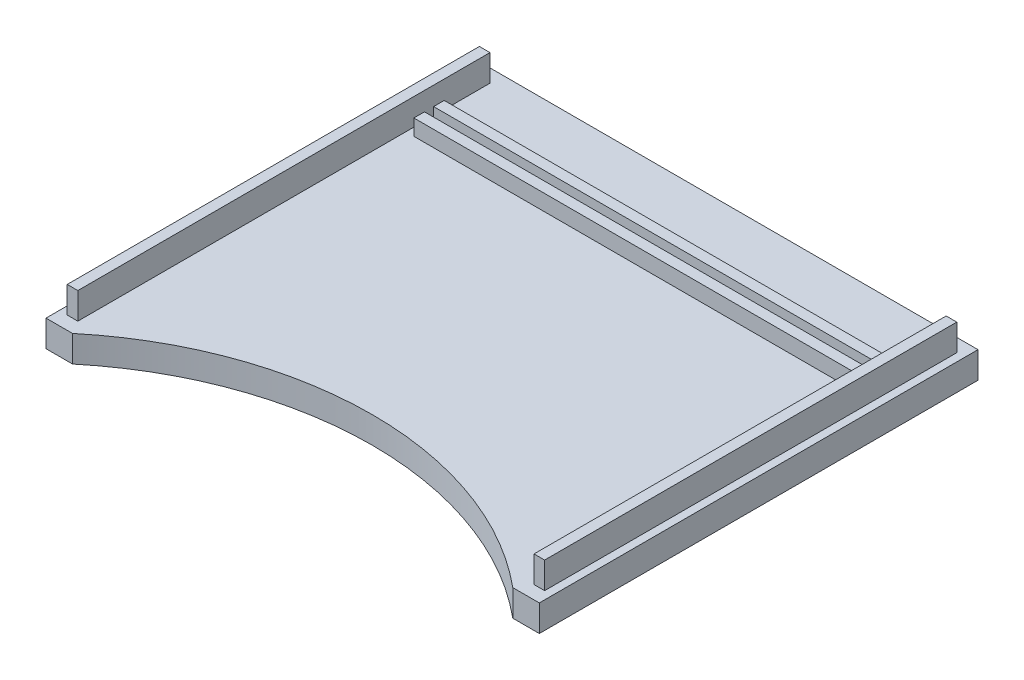
ISO-10303-21;
HEADER;
FILE_DESCRIPTION(('STEP AP214'),'2;1');
FILE_NAME('part.step','',(''),(''),'','','');
FILE_SCHEMA(('AUTOMOTIVE_DESIGN { 1 0 10303 214 1 1 1 1 }'));
ENDSEC;
DATA;
#1=APPLICATION_CONTEXT('core data for automotive mechanical design processes');
#2=APPLICATION_PROTOCOL_DEFINITION('international standard','automotive_design',2000,#1);
#3=PRODUCT_CONTEXT('',#1,'mechanical');
#4=PRODUCT('Part','Part','',(#3));
#5=PRODUCT_RELATED_PRODUCT_CATEGORY('part','',(#4));
#6=PRODUCT_DEFINITION_FORMATION('','',#4);
#7=PRODUCT_DEFINITION_CONTEXT('part definition',#1,'design');
#8=PRODUCT_DEFINITION('design','',#6,#7);
#9=PRODUCT_DEFINITION_SHAPE('','',#8);
#10=(LENGTH_UNIT() NAMED_UNIT(*) SI_UNIT(.MILLI.,.METRE.));
#11=(NAMED_UNIT(*) PLANE_ANGLE_UNIT() SI_UNIT($,.RADIAN.));
#12=(NAMED_UNIT(*) SI_UNIT($,.STERADIAN.) SOLID_ANGLE_UNIT());
#13=UNCERTAINTY_MEASURE_WITH_UNIT(LENGTH_MEASURE(1.E-05),#10,'distance_accuracy_value','');
#14=(GEOMETRIC_REPRESENTATION_CONTEXT(3) GLOBAL_UNCERTAINTY_ASSIGNED_CONTEXT((#13)) GLOBAL_UNIT_ASSIGNED_CONTEXT((#10,
#11,#12)) REPRESENTATION_CONTEXT('',''));
#15=CARTESIAN_POINT('',(0.,0.,0.));
#16=DIRECTION('',(0.,0.,1.));
#17=DIRECTION('',(1.,0.,0.));
#18=AXIS2_PLACEMENT_3D('',#15,#16,#17);
#19=CARTESIAN_POINT('',(0.,10.,0.));
#20=DIRECTION('',(0.,-1.,0.));
#21=DIRECTION('',(0.,0.,-1.));
#22=AXIS2_PLACEMENT_3D('',#19,#20,#21);
#23=PLANE('',#22);
#24=DIRECTION('',(0.,0.,1.));
#25=VECTOR('',#24,1.);
#26=CARTESIAN_POINT('',(179.,10.,-160.4));
#27=LINE('',#26,#25);
#28=CARTESIAN_POINT('',(179.,10.,-160.4));
#29=VERTEX_POINT('',#28);
#30=CARTESIAN_POINT('',(179.,10.,-5.));
#31=VERTEX_POINT('',#30);
#32=EDGE_CURVE('E205',#29,#31,#27,.T.);
#33=ORIENTED_EDGE('',*,*,#32,.F.);
#34=DIRECTION('',(-1.,0.,0.));
#35=VECTOR('',#34,1.);
#36=CARTESIAN_POINT('',(179.,10.,-160.4));
#37=LINE('',#36,#35);
#38=CARTESIAN_POINT('',(183.,10.,-160.4));
#39=VERTEX_POINT('',#38);
#40=EDGE_CURVE('E218',#39,#29,#37,.T.);
#41=ORIENTED_EDGE('',*,*,#40,.F.);
#42=DIRECTION('',(0.,0.,-1.));
#43=VECTOR('',#42,1.);
#44=CARTESIAN_POINT('',(183.,10.,-160.4));
#45=LINE('',#44,#43);
#46=CARTESIAN_POINT('',(183.,10.,-5.));
#47=VERTEX_POINT('',#46);
#48=EDGE_CURVE('E227',#47,#39,#45,.T.);
#49=ORIENTED_EDGE('',*,*,#48,.F.);
#50=DIRECTION('',(1.,0.,0.));
#51=VECTOR('',#50,1.);
#52=CARTESIAN_POINT('',(179.,10.,-5.));
#53=LINE('',#52,#51);
#54=EDGE_CURVE('E208',#31,#47,#53,.T.);
#55=ORIENTED_EDGE('',*,*,#54,.F.);
#56=EDGE_LOOP('',(#33,#41,#49,#55));
#57=FACE_BOUND('',#56,.T.);
#58=DIRECTION('',(0.,0.,1.));
#59=VECTOR('',#58,1.);
#60=CARTESIAN_POINT('',(9.99999999999995,10.,-132.7));
#61=LINE('',#60,#59);
#62=CARTESIAN_POINT('',(9.99999999999995,10.,-132.7));
#63=VERTEX_POINT('',#62);
#64=CARTESIAN_POINT('',(9.99999999999994,10.,-128.7));
#65=VERTEX_POINT('',#64);
#66=EDGE_CURVE('E276',#63,#65,#61,.T.);
#67=ORIENTED_EDGE('',*,*,#66,.F.);
#68=DIRECTION('',(-1.,0.,0.));
#69=VECTOR('',#68,1.);
#70=CARTESIAN_POINT('',(9.99999999999995,10.,-132.7));
#71=LINE('',#70,#69);
#72=CARTESIAN_POINT('',(176.,10.,-132.7));
#73=VERTEX_POINT('',#72);
#74=EDGE_CURVE('E281',#73,#63,#71,.T.);
#75=ORIENTED_EDGE('',*,*,#74,.F.);
#76=DIRECTION('',(0.,0.,-1.));
#77=VECTOR('',#76,1.);
#78=CARTESIAN_POINT('',(176.,10.,-132.7));
#79=LINE('',#78,#77);
#80=CARTESIAN_POINT('',(176.,10.,-128.7));
#81=VERTEX_POINT('',#80);
#82=EDGE_CURVE('E293',#81,#73,#79,.T.);
#83=ORIENTED_EDGE('',*,*,#82,.F.);
#84=DIRECTION('',(1.,0.,0.));
#85=VECTOR('',#84,1.);
#86=CARTESIAN_POINT('',(9.99999999999994,10.,-128.7));
#87=LINE('',#86,#85);
#88=EDGE_CURVE('E290',#65,#81,#87,.T.);
#89=ORIENTED_EDGE('',*,*,#88,.F.);
#90=EDGE_LOOP('',(#67,#75,#83,#89));
#91=FACE_BOUND('',#90,.T.);
#92=DIRECTION('',(1.,0.,0.));
#93=VECTOR('',#92,1.);
#94=CARTESIAN_POINT('',(0.,10.,0.));
#95=LINE('',#94,#93);
#96=CARTESIAN_POINT('',(0.,10.,0.));
#97=VERTEX_POINT('',#96);
#98=CARTESIAN_POINT('',(10.,10.,0.));
#99=VERTEX_POINT('',#98);
#100=EDGE_CURVE('E325',#97,#99,#95,.T.);
#101=ORIENTED_EDGE('',*,*,#100,.T.);
#102=CARTESIAN_POINT('',(93.,10.,99.8166666666667));
#103=DIRECTION('',(0.,1.,0.));
#104=DIRECTION('',(0.,0.,-1.));
#105=AXIS2_PLACEMENT_3D('',#102,#103,#104);
#106=CIRCLE('',#105,129.816666666667);
#107=CARTESIAN_POINT('',(176.,10.,0.));
#108=VERTEX_POINT('',#107);
#109=EDGE_CURVE('E309',#108,#99,#106,.T.);
#110=ORIENTED_EDGE('',*,*,#109,.F.);
#111=CARTESIAN_POINT('',(186.,10.,0.));
#112=VERTEX_POINT('',#111);
#113=EDGE_CURVE('E323',#108,#112,#95,.T.);
#114=ORIENTED_EDGE('',*,*,#113,.T.);
#115=DIRECTION('',(0.,0.,-1.));
#116=VECTOR('',#115,1.);
#117=CARTESIAN_POINT('',(186.,10.,0.));
#118=LINE('',#117,#116);
#119=CARTESIAN_POINT('',(186.,10.,-165.4));
#120=VERTEX_POINT('',#119);
#121=EDGE_CURVE('E328',#112,#120,#118,.T.);
#122=ORIENTED_EDGE('',*,*,#121,.T.);
#123=DIRECTION('',(-1.,0.,0.));
#124=VECTOR('',#123,1.);
#125=CARTESIAN_POINT('',(0.,10.,-165.4));
#126=LINE('',#125,#124);
#127=CARTESIAN_POINT('',(0.,10.,-165.4));
#128=VERTEX_POINT('',#127);
#129=EDGE_CURVE('E330',#120,#128,#126,.T.);
#130=ORIENTED_EDGE('',*,*,#129,.T.);
#131=DIRECTION('',(0.,0.,1.));
#132=VECTOR('',#131,1.);
#133=CARTESIAN_POINT('',(0.,10.,0.));
#134=LINE('',#133,#132);
#135=EDGE_CURVE('E320',#128,#97,#134,.T.);
#136=ORIENTED_EDGE('',*,*,#135,.T.);
#137=EDGE_LOOP('',(#101,#110,#114,#122,#130,#136));
#138=FACE_BOUND('',#137,.T.);
#139=DIRECTION('',(0.,0.,1.));
#140=VECTOR('',#139,1.);
#141=CARTESIAN_POINT('',(9.99999999999991,10.,-140.14));
#142=LINE('',#141,#140);
#143=CARTESIAN_POINT('',(9.99999999999991,10.,-140.14));
#144=VERTEX_POINT('',#143);
#145=CARTESIAN_POINT('',(9.99999999999991,10.,-136.14));
#146=VERTEX_POINT('',#145);
#147=EDGE_CURVE('E243',#144,#146,#142,.T.);
#148=ORIENTED_EDGE('',*,*,#147,.F.);
#149=DIRECTION('',(-1.,0.,0.));
#150=VECTOR('',#149,1.);
#151=CARTESIAN_POINT('',(9.99999999999991,10.,-140.14));
#152=LINE('',#151,#150);
#153=CARTESIAN_POINT('',(176.,10.,-140.14));
#154=VERTEX_POINT('',#153);
#155=EDGE_CURVE('E248',#154,#144,#152,.T.);
#156=ORIENTED_EDGE('',*,*,#155,.F.);
#157=DIRECTION('',(0.,0.,-1.));
#158=VECTOR('',#157,1.);
#159=CARTESIAN_POINT('',(176.,10.,-140.14));
#160=LINE('',#159,#158);
#161=CARTESIAN_POINT('',(176.,10.,-136.14));
#162=VERTEX_POINT('',#161);
#163=EDGE_CURVE('E260',#162,#154,#160,.T.);
#164=ORIENTED_EDGE('',*,*,#163,.F.);
#165=DIRECTION('',(1.,0.,0.));
#166=VECTOR('',#165,1.);
#167=CARTESIAN_POINT('',(9.99999999999991,10.,-136.14));
#168=LINE('',#167,#166);
#169=EDGE_CURVE('E257',#146,#162,#168,.T.);
#170=ORIENTED_EDGE('',*,*,#169,.F.);
#171=EDGE_LOOP('',(#148,#156,#164,#170));
#172=FACE_BOUND('',#171,.T.);
#173=DIRECTION('',(0.,0.,1.));
#174=VECTOR('',#173,1.);
#175=CARTESIAN_POINT('',(2.99999999999994,10.,-160.4));
#176=LINE('',#175,#174);
#177=CARTESIAN_POINT('',(2.99999999999994,10.,-160.4));
#178=VERTEX_POINT('',#177);
#179=CARTESIAN_POINT('',(3.00000000000002,10.,-5.));
#180=VERTEX_POINT('',#179);
#181=EDGE_CURVE('E204',#178,#180,#176,.T.);
#182=ORIENTED_EDGE('',*,*,#181,.F.);
#183=DIRECTION('',(-1.,0.,0.));
#184=VECTOR('',#183,1.);
#185=CARTESIAN_POINT('',(2.99999999999994,10.,-160.4));
#186=LINE('',#185,#184);
#187=CARTESIAN_POINT('',(6.99999999999994,10.,-160.4));
#188=VERTEX_POINT('',#187);
#189=EDGE_CURVE('E201',#188,#178,#186,.T.);
#190=ORIENTED_EDGE('',*,*,#189,.F.);
#191=DIRECTION('',(0.,0.,-1.));
#192=VECTOR('',#191,1.);
#193=CARTESIAN_POINT('',(6.99999999999994,10.,-160.4));
#194=LINE('',#193,#192);
#195=CARTESIAN_POINT('',(7.00000000000002,10.,-5.));
#196=VERTEX_POINT('',#195);
#197=EDGE_CURVE('E55',#196,#188,#194,.T.);
#198=ORIENTED_EDGE('',*,*,#197,.F.);
#199=DIRECTION('',(1.,0.,0.));
#200=VECTOR('',#199,1.);
#201=CARTESIAN_POINT('',(3.00000000000002,10.,-5.));
#202=LINE('',#201,#200);
#203=EDGE_CURVE('E50',#180,#196,#202,.T.);
#204=ORIENTED_EDGE('',*,*,#203,.F.);
#205=EDGE_LOOP('',(#182,#190,#198,#204));
#206=FACE_BOUND('',#205,.T.);
#207=ADVANCED_FACE('F35',(#57,#91,#138,#172,#206),#23,.F.);
#208=CARTESIAN_POINT('',(0.,10.,0.));
#209=DIRECTION('',(0.,0.,-1.));
#210=DIRECTION('',(-1.,0.,0.));
#211=AXIS2_PLACEMENT_3D('',#208,#209,#210);
#212=PLANE('',#211);
#213=DIRECTION('',(1.,0.,0.));
#214=VECTOR('',#213,1.);
#215=CARTESIAN_POINT('',(0.,0.,0.));
#216=LINE('',#215,#214);
#217=CARTESIAN_POINT('',(0.,0.,0.));
#218=VERTEX_POINT('',#217);
#219=CARTESIAN_POINT('',(10.,0.,0.));
#220=VERTEX_POINT('',#219);
#221=EDGE_CURVE('E336',#218,#220,#216,.T.);
#222=ORIENTED_EDGE('',*,*,#221,.T.);
#223=DIRECTION('',(0.,1.,0.));
#224=VECTOR('',#223,1.);
#225=CARTESIAN_POINT('',(10.,0.,0.));
#226=LINE('',#225,#224);
#227=EDGE_CURVE('E313',#220,#99,#226,.T.);
#228=ORIENTED_EDGE('',*,*,#227,.T.);
#229=ORIENTED_EDGE('',*,*,#100,.F.);
#230=DIRECTION('',(0.,-1.,0.));
#231=VECTOR('',#230,1.);
#232=CARTESIAN_POINT('',(0.,10.,0.));
#233=LINE('',#232,#231);
#234=EDGE_CURVE('E11',#97,#218,#233,.T.);
#235=ORIENTED_EDGE('',*,*,#234,.T.);
#236=EDGE_LOOP('',(#222,#228,#229,#235));
#237=FACE_BOUND('',#236,.T.);
#238=ADVANCED_FACE('F375',(#237),#212,.F.);
#239=CARTESIAN_POINT('',(0.,10.,0.));
#240=DIRECTION('',(1.,0.,0.));
#241=DIRECTION('',(0.,0.,-1.));
#242=AXIS2_PLACEMENT_3D('',#239,#240,#241);
#243=PLANE('',#242);
#244=DIRECTION('',(0.,0.,1.));
#245=VECTOR('',#244,1.);
#246=CARTESIAN_POINT('',(0.,0.,0.));
#247=LINE('',#246,#245);
#248=CARTESIAN_POINT('',(0.,0.,-165.4));
#249=VERTEX_POINT('',#248);
#250=EDGE_CURVE('E317',#249,#218,#247,.T.);
#251=ORIENTED_EDGE('',*,*,#250,.T.);
#252=ORIENTED_EDGE('',*,*,#234,.F.);
#253=ORIENTED_EDGE('',*,*,#135,.F.);
#254=DIRECTION('',(0.,-1.,0.));
#255=VECTOR('',#254,1.);
#256=CARTESIAN_POINT('',(0.,10.,-165.4));
#257=LINE('',#256,#255);
#258=EDGE_CURVE('E332',#128,#249,#257,.T.);
#259=ORIENTED_EDGE('',*,*,#258,.T.);
#260=EDGE_LOOP('',(#251,#252,#253,#259));
#261=FACE_BOUND('',#260,.T.);
#262=ADVANCED_FACE('F37',(#261),#243,.F.);
#263=ORIENTED_EDGE('',*,*,#113,.F.);
#264=DIRECTION('',(0.,1.,0.));
#265=VECTOR('',#264,1.);
#266=CARTESIAN_POINT('',(176.,0.,0.));
#267=LINE('',#266,#265);
#268=CARTESIAN_POINT('',(176.,0.,0.));
#269=VERTEX_POINT('',#268);
#270=EDGE_CURVE('E315',#269,#108,#267,.T.);
#271=ORIENTED_EDGE('',*,*,#270,.F.);
#272=CARTESIAN_POINT('',(186.,0.,0.));
#273=VERTEX_POINT('',#272);
#274=EDGE_CURVE('E335',#269,#273,#216,.T.);
#275=ORIENTED_EDGE('',*,*,#274,.T.);
#276=DIRECTION('',(0.,-1.,0.));
#277=VECTOR('',#276,1.);
#278=CARTESIAN_POINT('',(186.,10.,0.));
#279=LINE('',#278,#277);
#280=EDGE_CURVE('E43',#112,#273,#279,.T.);
#281=ORIENTED_EDGE('',*,*,#280,.F.);
#282=EDGE_LOOP('',(#263,#271,#275,#281));
#283=FACE_BOUND('',#282,.T.);
#284=ADVANCED_FACE('F371',(#283),#212,.F.);
#285=CARTESIAN_POINT('',(186.,10.,0.));
#286=DIRECTION('',(-1.,0.,0.));
#287=DIRECTION('',(0.,0.,1.));
#288=AXIS2_PLACEMENT_3D('',#285,#286,#287);
#289=PLANE('',#288);
#290=DIRECTION('',(0.,0.,-1.));
#291=VECTOR('',#290,1.);
#292=CARTESIAN_POINT('',(186.,0.,0.));
#293=LINE('',#292,#291);
#294=CARTESIAN_POINT('',(186.,0.,-165.4));
#295=VERTEX_POINT('',#294);
#296=EDGE_CURVE('E339',#273,#295,#293,.T.);
#297=ORIENTED_EDGE('',*,*,#296,.T.);
#298=DIRECTION('',(0.,-1.,0.));
#299=VECTOR('',#298,1.);
#300=CARTESIAN_POINT('',(186.,10.,-165.4));
#301=LINE('',#300,#299);
#302=EDGE_CURVE('E344',#120,#295,#301,.T.);
#303=ORIENTED_EDGE('',*,*,#302,.F.);
#304=ORIENTED_EDGE('',*,*,#121,.F.);
#305=ORIENTED_EDGE('',*,*,#280,.T.);
#306=EDGE_LOOP('',(#297,#303,#304,#305));
#307=FACE_BOUND('',#306,.T.);
#308=ADVANCED_FACE('F351',(#307),#289,.F.);
#309=CARTESIAN_POINT('',(0.,10.,-165.4));
#310=DIRECTION('',(0.,0.,1.));
#311=DIRECTION('',(1.,0.,0.));
#312=AXIS2_PLACEMENT_3D('',#309,#310,#311);
#313=PLANE('',#312);
#314=DIRECTION('',(-1.,0.,0.));
#315=VECTOR('',#314,1.);
#316=CARTESIAN_POINT('',(0.,0.,-165.4));
#317=LINE('',#316,#315);
#318=EDGE_CURVE('E324',#295,#249,#317,.T.);
#319=ORIENTED_EDGE('',*,*,#318,.T.);
#320=ORIENTED_EDGE('',*,*,#258,.F.);
#321=ORIENTED_EDGE('',*,*,#129,.F.);
#322=ORIENTED_EDGE('',*,*,#302,.T.);
#323=EDGE_LOOP('',(#319,#320,#321,#322));
#324=FACE_BOUND('',#323,.T.);
#325=ADVANCED_FACE('F362',(#324),#313,.F.);
#326=CARTESIAN_POINT('',(0.,0.,0.));
#327=DIRECTION('',(0.,-1.,0.));
#328=DIRECTION('',(0.,0.,-1.));
#329=AXIS2_PLACEMENT_3D('',#326,#327,#328);
#330=PLANE('',#329);
#331=CARTESIAN_POINT('',(93.,0.,99.8166666666667));
#332=DIRECTION('',(0.,1.,0.));
#333=DIRECTION('',(0.,0.,-1.));
#334=AXIS2_PLACEMENT_3D('',#331,#332,#333);
#335=CIRCLE('',#334,129.816666666667);
#336=EDGE_CURVE('E310',#269,#220,#335,.T.);
#337=ORIENTED_EDGE('',*,*,#336,.T.);
#338=ORIENTED_EDGE('',*,*,#221,.F.);
#339=ORIENTED_EDGE('',*,*,#250,.F.);
#340=ORIENTED_EDGE('',*,*,#318,.F.);
#341=ORIENTED_EDGE('',*,*,#296,.F.);
#342=ORIENTED_EDGE('',*,*,#274,.F.);
#343=EDGE_LOOP('',(#337,#338,#339,#340,#341,#342));
#344=FACE_BOUND('',#343,.T.);
#345=ADVANCED_FACE('F358',(#344),#330,.T.);
#346=CARTESIAN_POINT('',(93.,0.,99.8166666666667));
#347=DIRECTION('',(0.,1.,0.));
#348=DIRECTION('',(0.,0.,1.));
#349=AXIS2_PLACEMENT_3D('',#346,#347,#348);
#350=CYLINDRICAL_SURFACE('',#349,129.816666666667);
#351=ORIENTED_EDGE('',*,*,#109,.T.);
#352=ORIENTED_EDGE('',*,*,#227,.F.);
#353=ORIENTED_EDGE('',*,*,#336,.F.);
#354=ORIENTED_EDGE('',*,*,#270,.T.);
#355=EDGE_LOOP('',(#351,#352,#353,#354));
#356=FACE_BOUND('',#355,.T.);
#357=ADVANCED_FACE('F373',(#356),#350,.F.);
#358=CARTESIAN_POINT('',(9.99999999999995,16.,-132.7));
#359=DIRECTION('',(1.,0.,0.));
#360=DIRECTION('',(0.,0.,-1.));
#361=AXIS2_PLACEMENT_3D('',#358,#359,#360);
#362=PLANE('',#361);
#363=ORIENTED_EDGE('',*,*,#66,.T.);
#364=DIRECTION('',(0.,-1.,0.));
#365=VECTOR('',#364,1.);
#366=CARTESIAN_POINT('',(9.99999999999994,16.,-128.7));
#367=LINE('',#366,#365);
#368=CARTESIAN_POINT('',(9.99999999999994,16.,-128.7));
#369=VERTEX_POINT('',#368);
#370=EDGE_CURVE('E306',#369,#65,#367,.T.);
#371=ORIENTED_EDGE('',*,*,#370,.F.);
#372=DIRECTION('',(0.,0.,1.));
#373=VECTOR('',#372,1.);
#374=CARTESIAN_POINT('',(9.99999999999995,16.,-132.7));
#375=LINE('',#374,#373);
#376=CARTESIAN_POINT('',(9.99999999999995,16.,-132.7));
#377=VERTEX_POINT('',#376);
#378=EDGE_CURVE('E277',#377,#369,#375,.T.);
#379=ORIENTED_EDGE('',*,*,#378,.F.);
#380=DIRECTION('',(0.,-1.,0.));
#381=VECTOR('',#380,1.);
#382=CARTESIAN_POINT('',(9.99999999999995,16.,-132.7));
#383=LINE('',#382,#381);
#384=EDGE_CURVE('E287',#377,#63,#383,.T.);
#385=ORIENTED_EDGE('',*,*,#384,.T.);
#386=EDGE_LOOP('',(#363,#371,#379,#385));
#387=FACE_BOUND('',#386,.T.);
#388=ADVANCED_FACE('F397',(#387),#362,.F.);
#389=CARTESIAN_POINT('',(9.99999999999994,16.,-128.7));
#390=DIRECTION('',(0.,0.,-1.));
#391=DIRECTION('',(-1.,0.,0.));
#392=AXIS2_PLACEMENT_3D('',#389,#390,#391);
#393=PLANE('',#392);
#394=ORIENTED_EDGE('',*,*,#88,.T.);
#395=DIRECTION('',(0.,-1.,0.));
#396=VECTOR('',#395,1.);
#397=CARTESIAN_POINT('',(176.,16.,-128.7));
#398=LINE('',#397,#396);
#399=CARTESIAN_POINT('',(176.,16.,-128.7));
#400=VERTEX_POINT('',#399);
#401=EDGE_CURVE('E303',#400,#81,#398,.T.);
#402=ORIENTED_EDGE('',*,*,#401,.F.);
#403=DIRECTION('',(1.,0.,0.));
#404=VECTOR('',#403,1.);
#405=CARTESIAN_POINT('',(9.99999999999994,16.,-128.7));
#406=LINE('',#405,#404);
#407=EDGE_CURVE('E280',#369,#400,#406,.T.);
#408=ORIENTED_EDGE('',*,*,#407,.F.);
#409=ORIENTED_EDGE('',*,*,#370,.T.);
#410=EDGE_LOOP('',(#394,#402,#408,#409));
#411=FACE_BOUND('',#410,.T.);
#412=ADVANCED_FACE('F400',(#411),#393,.F.);
#413=CARTESIAN_POINT('',(176.,16.,-132.7));
#414=DIRECTION('',(-1.,0.,0.));
#415=DIRECTION('',(0.,0.,1.));
#416=AXIS2_PLACEMENT_3D('',#413,#414,#415);
#417=PLANE('',#416);
#418=ORIENTED_EDGE('',*,*,#82,.T.);
#419=DIRECTION('',(0.,-1.,0.));
#420=VECTOR('',#419,1.);
#421=CARTESIAN_POINT('',(176.,16.,-132.7));
#422=LINE('',#421,#420);
#423=CARTESIAN_POINT('',(176.,16.,-132.7));
#424=VERTEX_POINT('',#423);
#425=EDGE_CURVE('E300',#424,#73,#422,.T.);
#426=ORIENTED_EDGE('',*,*,#425,.F.);
#427=DIRECTION('',(0.,0.,-1.));
#428=VECTOR('',#427,1.);
#429=CARTESIAN_POINT('',(176.,16.,-132.7));
#430=LINE('',#429,#428);
#431=EDGE_CURVE('E283',#400,#424,#430,.T.);
#432=ORIENTED_EDGE('',*,*,#431,.F.);
#433=ORIENTED_EDGE('',*,*,#401,.T.);
#434=EDGE_LOOP('',(#418,#426,#432,#433));
#435=FACE_BOUND('',#434,.T.);
#436=ADVANCED_FACE('F404',(#435),#417,.F.);
#437=CARTESIAN_POINT('',(9.99999999999995,16.,-132.7));
#438=DIRECTION('',(0.,0.,1.));
#439=DIRECTION('',(1.,0.,0.));
#440=AXIS2_PLACEMENT_3D('',#437,#438,#439);
#441=PLANE('',#440);
#442=ORIENTED_EDGE('',*,*,#74,.T.);
#443=ORIENTED_EDGE('',*,*,#384,.F.);
#444=DIRECTION('',(-1.,0.,0.));
#445=VECTOR('',#444,1.);
#446=CARTESIAN_POINT('',(9.99999999999995,16.,-132.7));
#447=LINE('',#446,#445);
#448=EDGE_CURVE('E285',#424,#377,#447,.T.);
#449=ORIENTED_EDGE('',*,*,#448,.F.);
#450=ORIENTED_EDGE('',*,*,#425,.T.);
#451=EDGE_LOOP('',(#442,#443,#449,#450));
#452=FACE_BOUND('',#451,.T.);
#453=ADVANCED_FACE('F408',(#452),#441,.F.);
#454=CARTESIAN_POINT('',(0.,16.,0.));
#455=DIRECTION('',(0.,1.,0.));
#456=DIRECTION('',(0.,0.,1.));
#457=AXIS2_PLACEMENT_3D('',#454,#455,#456);
#458=PLANE('',#457);
#459=ORIENTED_EDGE('',*,*,#378,.T.);
#460=ORIENTED_EDGE('',*,*,#407,.T.);
#461=ORIENTED_EDGE('',*,*,#431,.T.);
#462=ORIENTED_EDGE('',*,*,#448,.T.);
#463=EDGE_LOOP('',(#459,#460,#461,#462));
#464=FACE_BOUND('',#463,.T.);
#465=ADVANCED_FACE('F412',(#464),#458,.T.);
#466=CARTESIAN_POINT('',(9.99999999999991,16.,-140.14));
#467=DIRECTION('',(1.,0.,0.));
#468=DIRECTION('',(0.,0.,-1.));
#469=AXIS2_PLACEMENT_3D('',#466,#467,#468);
#470=PLANE('',#469);
#471=ORIENTED_EDGE('',*,*,#147,.T.);
#472=DIRECTION('',(0.,-1.,0.));
#473=VECTOR('',#472,1.);
#474=CARTESIAN_POINT('',(9.99999999999991,16.,-136.14));
#475=LINE('',#474,#473);
#476=CARTESIAN_POINT('',(9.99999999999991,16.,-136.14));
#477=VERTEX_POINT('',#476);
#478=EDGE_CURVE('E273',#477,#146,#475,.T.);
#479=ORIENTED_EDGE('',*,*,#478,.F.);
#480=DIRECTION('',(0.,0.,1.));
#481=VECTOR('',#480,1.);
#482=CARTESIAN_POINT('',(9.99999999999991,16.,-140.14));
#483=LINE('',#482,#481);
#484=CARTESIAN_POINT('',(9.99999999999991,16.,-140.14));
#485=VERTEX_POINT('',#484);
#486=EDGE_CURVE('E244',#485,#477,#483,.T.);
#487=ORIENTED_EDGE('',*,*,#486,.F.);
#488=DIRECTION('',(0.,-1.,0.));
#489=VECTOR('',#488,1.);
#490=CARTESIAN_POINT('',(9.99999999999991,16.,-140.14));
#491=LINE('',#490,#489);
#492=EDGE_CURVE('E254',#485,#144,#491,.T.);
#493=ORIENTED_EDGE('',*,*,#492,.T.);
#494=EDGE_LOOP('',(#471,#479,#487,#493));
#495=FACE_BOUND('',#494,.T.);
#496=ADVANCED_FACE('F416',(#495),#470,.F.);
#497=CARTESIAN_POINT('',(9.99999999999991,16.,-136.14));
#498=DIRECTION('',(0.,0.,-1.));
#499=DIRECTION('',(-1.,0.,0.));
#500=AXIS2_PLACEMENT_3D('',#497,#498,#499);
#501=PLANE('',#500);
#502=ORIENTED_EDGE('',*,*,#169,.T.);
#503=DIRECTION('',(0.,-1.,0.));
#504=VECTOR('',#503,1.);
#505=CARTESIAN_POINT('',(176.,16.,-136.14));
#506=LINE('',#505,#504);
#507=CARTESIAN_POINT('',(176.,16.,-136.14));
#508=VERTEX_POINT('',#507);
#509=EDGE_CURVE('E270',#508,#162,#506,.T.);
#510=ORIENTED_EDGE('',*,*,#509,.F.);
#511=DIRECTION('',(1.,0.,0.));
#512=VECTOR('',#511,1.);
#513=CARTESIAN_POINT('',(9.99999999999991,16.,-136.14));
#514=LINE('',#513,#512);
#515=EDGE_CURVE('E247',#477,#508,#514,.T.);
#516=ORIENTED_EDGE('',*,*,#515,.F.);
#517=ORIENTED_EDGE('',*,*,#478,.T.);
#518=EDGE_LOOP('',(#502,#510,#516,#517));
#519=FACE_BOUND('',#518,.T.);
#520=ADVANCED_FACE('F420',(#519),#501,.F.);
#521=CARTESIAN_POINT('',(176.,16.,-140.14));
#522=DIRECTION('',(-1.,0.,0.));
#523=DIRECTION('',(0.,0.,1.));
#524=AXIS2_PLACEMENT_3D('',#521,#522,#523);
#525=PLANE('',#524);
#526=ORIENTED_EDGE('',*,*,#163,.T.);
#527=DIRECTION('',(0.,-1.,0.));
#528=VECTOR('',#527,1.);
#529=CARTESIAN_POINT('',(176.,16.,-140.14));
#530=LINE('',#529,#528);
#531=CARTESIAN_POINT('',(176.,16.,-140.14));
#532=VERTEX_POINT('',#531);
#533=EDGE_CURVE('E267',#532,#154,#530,.T.);
#534=ORIENTED_EDGE('',*,*,#533,.F.);
#535=DIRECTION('',(0.,0.,-1.));
#536=VECTOR('',#535,1.);
#537=CARTESIAN_POINT('',(176.,16.,-140.14));
#538=LINE('',#537,#536);
#539=EDGE_CURVE('E250',#508,#532,#538,.T.);
#540=ORIENTED_EDGE('',*,*,#539,.F.);
#541=ORIENTED_EDGE('',*,*,#509,.T.);
#542=EDGE_LOOP('',(#526,#534,#540,#541));
#543=FACE_BOUND('',#542,.T.);
#544=ADVANCED_FACE('F424',(#543),#525,.F.);
#545=CARTESIAN_POINT('',(9.99999999999991,16.,-140.14));
#546=DIRECTION('',(0.,0.,1.));
#547=DIRECTION('',(1.,0.,0.));
#548=AXIS2_PLACEMENT_3D('',#545,#546,#547);
#549=PLANE('',#548);
#550=ORIENTED_EDGE('',*,*,#155,.T.);
#551=ORIENTED_EDGE('',*,*,#492,.F.);
#552=DIRECTION('',(-1.,0.,0.));
#553=VECTOR('',#552,1.);
#554=CARTESIAN_POINT('',(9.99999999999991,16.,-140.14));
#555=LINE('',#554,#553);
#556=EDGE_CURVE('E252',#532,#485,#555,.T.);
#557=ORIENTED_EDGE('',*,*,#556,.F.);
#558=ORIENTED_EDGE('',*,*,#533,.T.);
#559=EDGE_LOOP('',(#550,#551,#557,#558));
#560=FACE_BOUND('',#559,.T.);
#561=ADVANCED_FACE('F428',(#560),#549,.F.);
#562=CARTESIAN_POINT('',(0.,16.,0.));
#563=DIRECTION('',(0.,1.,0.));
#564=DIRECTION('',(0.,0.,1.));
#565=AXIS2_PLACEMENT_3D('',#562,#563,#564);
#566=PLANE('',#565);
#567=ORIENTED_EDGE('',*,*,#486,.T.);
#568=ORIENTED_EDGE('',*,*,#515,.T.);
#569=ORIENTED_EDGE('',*,*,#539,.T.);
#570=ORIENTED_EDGE('',*,*,#556,.T.);
#571=EDGE_LOOP('',(#567,#568,#569,#570));
#572=FACE_BOUND('',#571,.T.);
#573=ADVANCED_FACE('F432',(#572),#566,.T.);
#574=CARTESIAN_POINT('',(179.,20.,-160.4));
#575=DIRECTION('',(1.,0.,0.));
#576=DIRECTION('',(0.,0.,-1.));
#577=AXIS2_PLACEMENT_3D('',#574,#575,#576);
#578=PLANE('',#577);
#579=ORIENTED_EDGE('',*,*,#32,.T.);
#580=DIRECTION('',(0.,-1.,0.));
#581=VECTOR('',#580,1.);
#582=CARTESIAN_POINT('',(179.,20.,-5.));
#583=LINE('',#582,#581);
#584=CARTESIAN_POINT('',(179.,20.,-5.));
#585=VERTEX_POINT('',#584);
#586=EDGE_CURVE('E240',#585,#31,#583,.T.);
#587=ORIENTED_EDGE('',*,*,#586,.F.);
#588=DIRECTION('',(0.,0.,1.));
#589=VECTOR('',#588,1.);
#590=CARTESIAN_POINT('',(179.,20.,-160.4));
#591=LINE('',#590,#589);
#592=CARTESIAN_POINT('',(179.,20.,-160.4));
#593=VERTEX_POINT('',#592);
#594=EDGE_CURVE('E214',#593,#585,#591,.T.);
#595=ORIENTED_EDGE('',*,*,#594,.F.);
#596=DIRECTION('',(0.,-1.,0.));
#597=VECTOR('',#596,1.);
#598=CARTESIAN_POINT('',(179.,20.,-160.4));
#599=LINE('',#598,#597);
#600=EDGE_CURVE('E223',#593,#29,#599,.T.);
#601=ORIENTED_EDGE('',*,*,#600,.T.);
#602=EDGE_LOOP('',(#579,#587,#595,#601));
#603=FACE_BOUND('',#602,.T.);
#604=ADVANCED_FACE('F436',(#603),#578,.F.);
#605=CARTESIAN_POINT('',(179.,20.,-5.));
#606=DIRECTION('',(0.,0.,-1.));
#607=DIRECTION('',(-1.,0.,0.));
#608=AXIS2_PLACEMENT_3D('',#605,#606,#607);
#609=PLANE('',#608);
#610=ORIENTED_EDGE('',*,*,#54,.T.);
#611=DIRECTION('',(0.,-1.,0.));
#612=VECTOR('',#611,1.);
#613=CARTESIAN_POINT('',(183.,20.,-5.));
#614=LINE('',#613,#612);
#615=CARTESIAN_POINT('',(183.,20.,-5.));
#616=VERTEX_POINT('',#615);
#617=EDGE_CURVE('E237',#616,#47,#614,.T.);
#618=ORIENTED_EDGE('',*,*,#617,.F.);
#619=DIRECTION('',(1.,0.,0.));
#620=VECTOR('',#619,1.);
#621=CARTESIAN_POINT('',(179.,20.,-5.));
#622=LINE('',#621,#620);
#623=EDGE_CURVE('E217',#585,#616,#622,.T.);
#624=ORIENTED_EDGE('',*,*,#623,.F.);
#625=ORIENTED_EDGE('',*,*,#586,.T.);
#626=EDGE_LOOP('',(#610,#618,#624,#625));
#627=FACE_BOUND('',#626,.T.);
#628=ADVANCED_FACE('F440',(#627),#609,.F.);
#629=CARTESIAN_POINT('',(183.,20.,-160.4));
#630=DIRECTION('',(-1.,0.,0.));
#631=DIRECTION('',(0.,0.,1.));
#632=AXIS2_PLACEMENT_3D('',#629,#630,#631);
#633=PLANE('',#632);
#634=ORIENTED_EDGE('',*,*,#48,.T.);
#635=DIRECTION('',(0.,-1.,0.));
#636=VECTOR('',#635,1.);
#637=CARTESIAN_POINT('',(183.,20.,-160.4));
#638=LINE('',#637,#636);
#639=CARTESIAN_POINT('',(183.,20.,-160.4));
#640=VERTEX_POINT('',#639);
#641=EDGE_CURVE('E234',#640,#39,#638,.T.);
#642=ORIENTED_EDGE('',*,*,#641,.F.);
#643=DIRECTION('',(0.,0.,-1.));
#644=VECTOR('',#643,1.);
#645=CARTESIAN_POINT('',(183.,20.,-160.4));
#646=LINE('',#645,#644);
#647=EDGE_CURVE('E220',#616,#640,#646,.T.);
#648=ORIENTED_EDGE('',*,*,#647,.F.);
#649=ORIENTED_EDGE('',*,*,#617,.T.);
#650=EDGE_LOOP('',(#634,#642,#648,#649));
#651=FACE_BOUND('',#650,.T.);
#652=ADVANCED_FACE('F444',(#651),#633,.F.);
#653=CARTESIAN_POINT('',(179.,20.,-160.4));
#654=DIRECTION('',(0.,0.,1.));
#655=DIRECTION('',(1.,0.,0.));
#656=AXIS2_PLACEMENT_3D('',#653,#654,#655);
#657=PLANE('',#656);
#658=ORIENTED_EDGE('',*,*,#40,.T.);
#659=ORIENTED_EDGE('',*,*,#600,.F.);
#660=DIRECTION('',(-1.,0.,0.));
#661=VECTOR('',#660,1.);
#662=CARTESIAN_POINT('',(179.,20.,-160.4));
#663=LINE('',#662,#661);
#664=EDGE_CURVE('E222',#640,#593,#663,.T.);
#665=ORIENTED_EDGE('',*,*,#664,.F.);
#666=ORIENTED_EDGE('',*,*,#641,.T.);
#667=EDGE_LOOP('',(#658,#659,#665,#666));
#668=FACE_BOUND('',#667,.T.);
#669=ADVANCED_FACE('F448',(#668),#657,.F.);
#670=CARTESIAN_POINT('',(0.,20.,0.));
#671=DIRECTION('',(0.,1.,0.));
#672=DIRECTION('',(0.,0.,1.));
#673=AXIS2_PLACEMENT_3D('',#670,#671,#672);
#674=PLANE('',#673);
#675=ORIENTED_EDGE('',*,*,#594,.T.);
#676=ORIENTED_EDGE('',*,*,#623,.T.);
#677=ORIENTED_EDGE('',*,*,#647,.T.);
#678=ORIENTED_EDGE('',*,*,#664,.T.);
#679=EDGE_LOOP('',(#675,#676,#677,#678));
#680=FACE_BOUND('',#679,.T.);
#681=ADVANCED_FACE('F452',(#680),#674,.T.);
#682=CARTESIAN_POINT('',(2.99999999999994,20.,-160.4));
#683=DIRECTION('',(1.,0.,0.));
#684=DIRECTION('',(0.,0.,-1.));
#685=AXIS2_PLACEMENT_3D('',#682,#683,#684);
#686=PLANE('',#685);
#687=ORIENTED_EDGE('',*,*,#181,.T.);
#688=DIRECTION('',(0.,-1.,0.));
#689=VECTOR('',#688,1.);
#690=CARTESIAN_POINT('',(3.00000000000002,20.,-5.));
#691=LINE('',#690,#689);
#692=CARTESIAN_POINT('',(3.00000000000002,20.,-5.));
#693=VERTEX_POINT('',#692);
#694=EDGE_CURVE('E185',#693,#180,#691,.T.);
#695=ORIENTED_EDGE('',*,*,#694,.F.);
#696=DIRECTION('',(0.,0.,1.));
#697=VECTOR('',#696,1.);
#698=CARTESIAN_POINT('',(2.99999999999994,20.,-160.4));
#699=LINE('',#698,#697);
#700=CARTESIAN_POINT('',(2.99999999999994,20.,-160.4));
#701=VERTEX_POINT('',#700);
#702=EDGE_CURVE('E192',#701,#693,#699,.T.);
#703=ORIENTED_EDGE('',*,*,#702,.F.);
#704=DIRECTION('',(0.,-1.,0.));
#705=VECTOR('',#704,1.);
#706=CARTESIAN_POINT('',(2.99999999999994,20.,-160.4));
#707=LINE('',#706,#705);
#708=EDGE_CURVE('E634',#701,#178,#707,.T.);
#709=ORIENTED_EDGE('',*,*,#708,.T.);
#710=EDGE_LOOP('',(#687,#695,#703,#709));
#711=FACE_BOUND('',#710,.T.);
#712=ADVANCED_FACE('F203',(#711),#686,.F.);
#713=CARTESIAN_POINT('',(3.00000000000002,20.,-5.));
#714=DIRECTION('',(0.,0.,-1.));
#715=DIRECTION('',(-1.,0.,0.));
#716=AXIS2_PLACEMENT_3D('',#713,#714,#715);
#717=PLANE('',#716);
#718=ORIENTED_EDGE('',*,*,#203,.T.);
#719=DIRECTION('',(0.,-1.,0.));
#720=VECTOR('',#719,1.);
#721=CARTESIAN_POINT('',(7.00000000000002,20.,-5.));
#722=LINE('',#721,#720);
#723=CARTESIAN_POINT('',(7.00000000000002,20.,-5.));
#724=VERTEX_POINT('',#723);
#725=EDGE_CURVE('E188',#724,#196,#722,.T.);
#726=ORIENTED_EDGE('',*,*,#725,.F.);
#727=DIRECTION('',(1.,0.,0.));
#728=VECTOR('',#727,1.);
#729=CARTESIAN_POINT('',(3.00000000000002,20.,-5.));
#730=LINE('',#729,#728);
#731=EDGE_CURVE('E181',#693,#724,#730,.T.);
#732=ORIENTED_EDGE('',*,*,#731,.F.);
#733=ORIENTED_EDGE('',*,*,#694,.T.);
#734=EDGE_LOOP('',(#718,#726,#732,#733));
#735=FACE_BOUND('',#734,.T.);
#736=ADVANCED_FACE('F183',(#735),#717,.F.);
#737=CARTESIAN_POINT('',(6.99999999999994,20.,-160.4));
#738=DIRECTION('',(-1.,0.,0.));
#739=DIRECTION('',(0.,0.,1.));
#740=AXIS2_PLACEMENT_3D('',#737,#738,#739);
#741=PLANE('',#740);
#742=ORIENTED_EDGE('',*,*,#197,.T.);
#743=DIRECTION('',(0.,-1.,0.));
#744=VECTOR('',#743,1.);
#745=CARTESIAN_POINT('',(6.99999999999994,20.,-160.4));
#746=LINE('',#745,#744);
#747=CARTESIAN_POINT('',(6.99999999999994,20.,-160.4));
#748=VERTEX_POINT('',#747);
#749=EDGE_CURVE('E210',#748,#188,#746,.T.);
#750=ORIENTED_EDGE('',*,*,#749,.F.);
#751=DIRECTION('',(0.,0.,-1.));
#752=VECTOR('',#751,1.);
#753=CARTESIAN_POINT('',(6.99999999999994,20.,-160.4));
#754=LINE('',#753,#752);
#755=EDGE_CURVE('E191',#724,#748,#754,.T.);
#756=ORIENTED_EDGE('',*,*,#755,.F.);
#757=ORIENTED_EDGE('',*,*,#725,.T.);
#758=EDGE_LOOP('',(#742,#750,#756,#757));
#759=FACE_BOUND('',#758,.T.);
#760=ADVANCED_FACE('F461',(#759),#741,.F.);
#761=CARTESIAN_POINT('',(2.99999999999994,20.,-160.4));
#762=DIRECTION('',(0.,0.,1.));
#763=DIRECTION('',(1.,0.,0.));
#764=AXIS2_PLACEMENT_3D('',#761,#762,#763);
#765=PLANE('',#764);
#766=ORIENTED_EDGE('',*,*,#189,.T.);
#767=ORIENTED_EDGE('',*,*,#708,.F.);
#768=DIRECTION('',(-1.,0.,0.));
#769=VECTOR('',#768,1.);
#770=CARTESIAN_POINT('',(2.99999999999994,20.,-160.4));
#771=LINE('',#770,#769);
#772=EDGE_CURVE('E197',#748,#701,#771,.T.);
#773=ORIENTED_EDGE('',*,*,#772,.F.);
#774=ORIENTED_EDGE('',*,*,#749,.T.);
#775=EDGE_LOOP('',(#766,#767,#773,#774));
#776=FACE_BOUND('',#775,.T.);
#777=ADVANCED_FACE('F464',(#776),#765,.F.);
#778=CARTESIAN_POINT('',(0.,20.,0.));
#779=DIRECTION('',(0.,1.,0.));
#780=DIRECTION('',(0.,0.,1.));
#781=AXIS2_PLACEMENT_3D('',#778,#779,#780);
#782=PLANE('',#781);
#783=ORIENTED_EDGE('',*,*,#702,.T.);
#784=ORIENTED_EDGE('',*,*,#731,.T.);
#785=ORIENTED_EDGE('',*,*,#755,.T.);
#786=ORIENTED_EDGE('',*,*,#772,.T.);
#787=EDGE_LOOP('',(#783,#784,#785,#786));
#788=FACE_BOUND('',#787,.T.);
#789=ADVANCED_FACE('F195',(#788),#782,.T.);
#790=CLOSED_SHELL('',(#207,#238,#262,#284,#308,#325,#345,#357,#388,#412,#436,#453,#465,#496,
#520,#544,#561,#573,#604,#628,#652,#669,#681,#712,#736,#760,#777,#789));
#791=MANIFOLD_SOLID_BREP('B2',#790);
#792=ADVANCED_BREP_SHAPE_REPRESENTATION('',(#18,#791),#14);
#793=SHAPE_DEFINITION_REPRESENTATION(#9,#792);
ENDSEC;
END-ISO-10303-21;
